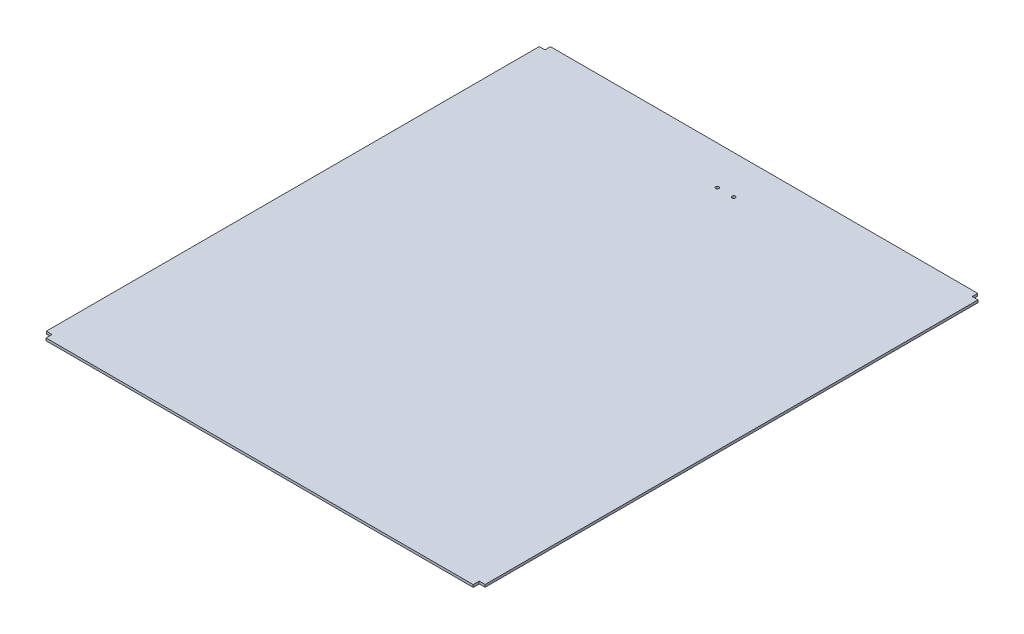
ISO-10303-21;
HEADER;
FILE_DESCRIPTION(('STEP AP214'),'2;1');
FILE_NAME('part.step','',(''),(''),'','','');
FILE_SCHEMA(('AUTOMOTIVE_DESIGN { 1 0 10303 214 1 1 1 1 }'));
ENDSEC;
DATA;
#1=APPLICATION_CONTEXT('core data for automotive mechanical design processes');
#2=APPLICATION_PROTOCOL_DEFINITION('international standard','automotive_design',2000,#1);
#3=PRODUCT_CONTEXT('',#1,'mechanical');
#4=PRODUCT('Part','Part','',(#3));
#5=PRODUCT_RELATED_PRODUCT_CATEGORY('part','',(#4));
#6=PRODUCT_DEFINITION_FORMATION('','',#4);
#7=PRODUCT_DEFINITION_CONTEXT('part definition',#1,'design');
#8=PRODUCT_DEFINITION('design','',#6,#7);
#9=PRODUCT_DEFINITION_SHAPE('','',#8);
#10=(LENGTH_UNIT() NAMED_UNIT(*) SI_UNIT(.MILLI.,.METRE.));
#11=(NAMED_UNIT(*) PLANE_ANGLE_UNIT() SI_UNIT($,.RADIAN.));
#12=(NAMED_UNIT(*) SI_UNIT($,.STERADIAN.) SOLID_ANGLE_UNIT());
#13=UNCERTAINTY_MEASURE_WITH_UNIT(LENGTH_MEASURE(1.E-05),#10,'distance_accuracy_value','');
#14=(GEOMETRIC_REPRESENTATION_CONTEXT(3) GLOBAL_UNCERTAINTY_ASSIGNED_CONTEXT((#13)) GLOBAL_UNIT_ASSIGNED_CONTEXT((#10,
#11,#12)) REPRESENTATION_CONTEXT('',''));
#15=CARTESIAN_POINT('',(0.,0.,0.));
#16=DIRECTION('',(0.,0.,1.));
#17=DIRECTION('',(1.,0.,0.));
#18=AXIS2_PLACEMENT_3D('',#15,#16,#17);
#19=CARTESIAN_POINT('',(0.0465208544824236,3.,-0.291126182503376));
#20=DIRECTION('',(0.,0.,-1.));
#21=DIRECTION('',(-1.,0.,0.));
#22=AXIS2_PLACEMENT_3D('',#19,#20,#21);
#23=PLANE('',#22);
#24=DIRECTION('',(0.,-1.,0.));
#25=VECTOR('',#24,1.);
#26=CARTESIAN_POINT('',(7.00000000000001,3.,-0.291126182503376));
#27=LINE('',#26,#25);
#28=CARTESIAN_POINT('',(6.99999999999996,3.,-0.291126182503376));
#29=VERTEX_POINT('',#28);
#30=CARTESIAN_POINT('',(6.99999999999996,0.,-0.291126182503376));
#31=VERTEX_POINT('',#30);
#32=EDGE_CURVE('E164',#29,#31,#27,.T.);
#33=ORIENTED_EDGE('',*,*,#32,.F.);
#34=DIRECTION('',(1.,0.,0.));
#35=VECTOR('',#34,1.);
#36=CARTESIAN_POINT('',(0.0465208544824236,3.,-0.291126182503376));
#37=LINE('',#36,#35);
#38=CARTESIAN_POINT('',(0.0465208544824236,3.,-0.291126182503376));
#39=VERTEX_POINT('',#38);
#40=EDGE_CURVE('E133',#39,#29,#37,.T.);
#41=ORIENTED_EDGE('',*,*,#40,.F.);
#42=DIRECTION('',(0.,-1.,0.));
#43=VECTOR('',#42,1.);
#44=CARTESIAN_POINT('',(0.0465208544824236,3.,-0.291126182503376));
#45=LINE('',#44,#43);
#46=CARTESIAN_POINT('',(0.0465208544824236,0.,-0.291126182503376));
#47=VERTEX_POINT('',#46);
#48=EDGE_CURVE('E11',#39,#47,#45,.T.);
#49=ORIENTED_EDGE('',*,*,#48,.T.);
#50=DIRECTION('',(1.,0.,0.));
#51=VECTOR('',#50,1.);
#52=CARTESIAN_POINT('',(0.0465208544824236,0.,-0.291126182503376));
#53=LINE('',#52,#51);
#54=EDGE_CURVE('E180',#47,#31,#53,.T.);
#55=ORIENTED_EDGE('',*,*,#54,.T.);
#56=EDGE_LOOP('',(#33,#41,#49,#55));
#57=FACE_BOUND('',#56,.T.);
#58=ADVANCED_FACE('F33',(#57),#23,.F.);
#59=DIRECTION('',(0.,1.,0.));
#60=VECTOR('',#59,1.);
#61=CARTESIAN_POINT('',(527.,3.,-0.291126182503376));
#62=LINE('',#61,#60);
#63=CARTESIAN_POINT('',(527.,0.,-0.291126182503376));
#64=VERTEX_POINT('',#63);
#65=CARTESIAN_POINT('',(527.,3.,-0.291126182503376));
#66=VERTEX_POINT('',#65);
#67=EDGE_CURVE('E154',#64,#66,#62,.T.);
#68=ORIENTED_EDGE('',*,*,#67,.F.);
#69=CARTESIAN_POINT('',(534.046520854482,0.,-0.291126182503376));
#70=VERTEX_POINT('',#69);
#71=EDGE_CURVE('E179',#64,#70,#53,.T.);
#72=ORIENTED_EDGE('',*,*,#71,.T.);
#73=DIRECTION('',(0.,-1.,0.));
#74=VECTOR('',#73,1.);
#75=CARTESIAN_POINT('',(534.046520854482,3.,-0.291126182503376));
#76=LINE('',#75,#74);
#77=CARTESIAN_POINT('',(534.046520854482,3.,-0.291126182503376));
#78=VERTEX_POINT('',#77);
#79=EDGE_CURVE('E42',#78,#70,#76,.T.);
#80=ORIENTED_EDGE('',*,*,#79,.F.);
#81=EDGE_CURVE('E169',#66,#78,#37,.T.);
#82=ORIENTED_EDGE('',*,*,#81,.F.);
#83=EDGE_LOOP('',(#68,#72,#80,#82));
#84=FACE_BOUND('',#83,.T.);
#85=ADVANCED_FACE('F255',(#84),#23,.F.);
#86=CARTESIAN_POINT('',(0.0465208544824236,3.,-600.291126182503));
#87=DIRECTION('',(0.,0.,1.));
#88=DIRECTION('',(1.,0.,0.));
#89=AXIS2_PLACEMENT_3D('',#86,#87,#88);
#90=PLANE('',#89);
#91=DIRECTION('',(0.,1.,0.));
#92=VECTOR('',#91,1.);
#93=CARTESIAN_POINT('',(6.99999999999992,3.,-600.291126182503));
#94=LINE('',#93,#92);
#95=CARTESIAN_POINT('',(6.99999999999992,0.,-600.291126182503));
#96=VERTEX_POINT('',#95);
#97=CARTESIAN_POINT('',(6.99999999999996,3.,-600.291126182503));
#98=VERTEX_POINT('',#97);
#99=EDGE_CURVE('E162',#96,#98,#94,.T.);
#100=ORIENTED_EDGE('',*,*,#99,.F.);
#101=DIRECTION('',(-1.,0.,0.));
#102=VECTOR('',#101,1.);
#103=CARTESIAN_POINT('',(0.0465208544824236,0.,-600.291126182503));
#104=LINE('',#103,#102);
#105=CARTESIAN_POINT('',(0.0465208544824236,0.,-600.291126182503));
#106=VERTEX_POINT('',#105);
#107=EDGE_CURVE('E184',#96,#106,#104,.T.);
#108=ORIENTED_EDGE('',*,*,#107,.T.);
#109=DIRECTION('',(0.,-1.,0.));
#110=VECTOR('',#109,1.);
#111=CARTESIAN_POINT('',(0.0465208544824236,3.,-600.291126182503));
#112=LINE('',#111,#110);
#113=CARTESIAN_POINT('',(0.0465208544824236,3.,-600.291126182503));
#114=VERTEX_POINT('',#113);
#115=EDGE_CURVE('E176',#114,#106,#112,.T.);
#116=ORIENTED_EDGE('',*,*,#115,.F.);
#117=DIRECTION('',(-1.,0.,0.));
#118=VECTOR('',#117,1.);
#119=CARTESIAN_POINT('',(0.0465208544824236,3.,-600.291126182503));
#120=LINE('',#119,#118);
#121=EDGE_CURVE('E50',#98,#114,#120,.T.);
#122=ORIENTED_EDGE('',*,*,#121,.F.);
#123=EDGE_LOOP('',(#100,#108,#116,#122));
#124=FACE_BOUND('',#123,.T.);
#125=ADVANCED_FACE('F260',(#124),#90,.F.);
#126=DIRECTION('',(0.,-1.,0.));
#127=VECTOR('',#126,1.);
#128=CARTESIAN_POINT('',(527.,3.,-600.291126182503));
#129=LINE('',#128,#127);
#130=CARTESIAN_POINT('',(527.,3.,-600.291126182503));
#131=VERTEX_POINT('',#130);
#132=CARTESIAN_POINT('',(527.,0.,-600.291126182503));
#133=VERTEX_POINT('',#132);
#134=EDGE_CURVE('E58',#131,#133,#129,.T.);
#135=ORIENTED_EDGE('',*,*,#134,.F.);
#136=CARTESIAN_POINT('',(534.046520854482,3.,-600.291126182503));
#137=VERTEX_POINT('',#136);
#138=EDGE_CURVE('E174',#137,#131,#120,.T.);
#139=ORIENTED_EDGE('',*,*,#138,.F.);
#140=DIRECTION('',(0.,-1.,0.));
#141=VECTOR('',#140,1.);
#142=CARTESIAN_POINT('',(534.046520854482,3.,-600.291126182503));
#143=LINE('',#142,#141);
#144=CARTESIAN_POINT('',(534.046520854482,0.,-600.291126182503));
#145=VERTEX_POINT('',#144);
#146=EDGE_CURVE('E188',#137,#145,#143,.T.);
#147=ORIENTED_EDGE('',*,*,#146,.T.);
#148=EDGE_CURVE('E170',#145,#133,#104,.T.);
#149=ORIENTED_EDGE('',*,*,#148,.T.);
#150=EDGE_LOOP('',(#135,#139,#147,#149));
#151=FACE_BOUND('',#150,.T.);
#152=ADVANCED_FACE('F269',(#151),#90,.F.);
#153=CARTESIAN_POINT('',(0.0465208544824236,3.,-0.291126182503376));
#154=DIRECTION('',(1.,0.,0.));
#155=DIRECTION('',(0.,0.,-1.));
#156=AXIS2_PLACEMENT_3D('',#153,#154,#155);
#157=PLANE('',#156);
#158=DIRECTION('',(0.,0.,1.));
#159=VECTOR('',#158,1.);
#160=CARTESIAN_POINT('',(0.0465208544824236,0.,-0.291126182503376));
#161=LINE('',#160,#159);
#162=EDGE_CURVE('E166',#106,#47,#161,.T.);
#163=ORIENTED_EDGE('',*,*,#162,.T.);
#164=ORIENTED_EDGE('',*,*,#48,.F.);
#165=DIRECTION('',(0.,0.,1.));
#166=VECTOR('',#165,1.);
#167=CARTESIAN_POINT('',(0.0465208544824236,3.,-0.291126182503376));
#168=LINE('',#167,#166);
#169=EDGE_CURVE('E167',#114,#39,#168,.T.);
#170=ORIENTED_EDGE('',*,*,#169,.F.);
#171=ORIENTED_EDGE('',*,*,#115,.T.);
#172=EDGE_LOOP('',(#163,#164,#170,#171));
#173=FACE_BOUND('',#172,.T.);
#174=ADVANCED_FACE('F35',(#173),#157,.F.);
#175=CARTESIAN_POINT('',(534.046520854482,3.,-0.291126182503376));
#176=DIRECTION('',(-1.,0.,0.));
#177=DIRECTION('',(0.,0.,1.));
#178=AXIS2_PLACEMENT_3D('',#175,#176,#177);
#179=PLANE('',#178);
#180=DIRECTION('',(0.,0.,-1.));
#181=VECTOR('',#180,1.);
#182=CARTESIAN_POINT('',(534.046520854482,0.,-0.291126182503376));
#183=LINE('',#182,#181);
#184=EDGE_CURVE('E182',#70,#145,#183,.T.);
#185=ORIENTED_EDGE('',*,*,#184,.T.);
#186=ORIENTED_EDGE('',*,*,#146,.F.);
#187=DIRECTION('',(0.,0.,-1.));
#188=VECTOR('',#187,1.);
#189=CARTESIAN_POINT('',(534.046520854482,3.,-0.291126182503376));
#190=LINE('',#189,#188);
#191=EDGE_CURVE('E172',#78,#137,#190,.T.);
#192=ORIENTED_EDGE('',*,*,#191,.F.);
#193=ORIENTED_EDGE('',*,*,#79,.T.);
#194=EDGE_LOOP('',(#185,#186,#192,#193));
#195=FACE_BOUND('',#194,.T.);
#196=ADVANCED_FACE('F263',(#195),#179,.F.);
#197=CARTESIAN_POINT('',(0.,3.,0.));
#198=DIRECTION('',(0.,-1.,0.));
#199=DIRECTION('',(0.,0.,-1.));
#200=AXIS2_PLACEMENT_3D('',#197,#198,#199);
#201=PLANE('',#200);
#202=CARTESIAN_POINT('',(257.025,3.,-560.));
#203=DIRECTION('',(0.,1.,0.));
#204=DIRECTION('',(0.,0.,1.));
#205=AXIS2_PLACEMENT_3D('',#202,#203,#204);
#206=CIRCLE('',#205,2.);
#207=CARTESIAN_POINT('',(257.025,3.,-558.));
#208=VERTEX_POINT('',#207);
#209=EDGE_CURVE('E194',#208,#208,#206,.T.);
#210=ORIENTED_EDGE('',*,*,#209,.F.);
#211=EDGE_LOOP('',(#210));
#212=FACE_BOUND('',#211,.T.);
#213=CARTESIAN_POINT('',(277.025,3.,-560.));
#214=DIRECTION('',(0.,1.,0.));
#215=DIRECTION('',(0.,0.,1.));
#216=AXIS2_PLACEMENT_3D('',#213,#214,#215);
#217=CIRCLE('',#216,2.);
#218=CARTESIAN_POINT('',(277.025,3.,-558.));
#219=VERTEX_POINT('',#218);
#220=EDGE_CURVE('E199',#219,#219,#217,.T.);
#221=ORIENTED_EDGE('',*,*,#220,.F.);
#222=EDGE_LOOP('',(#221));
#223=FACE_BOUND('',#222,.T.);
#224=ORIENTED_EDGE('',*,*,#138,.T.);
#225=DIRECTION('',(0.,0.,-1.));
#226=VECTOR('',#225,1.);
#227=CARTESIAN_POINT('',(527.,3.,-607.));
#228=LINE('',#227,#226);
#229=CARTESIAN_POINT('',(527.,3.,-607.));
#230=VERTEX_POINT('',#229);
#231=EDGE_CURVE('E147',#131,#230,#228,.T.);
#232=ORIENTED_EDGE('',*,*,#231,.T.);
#233=DIRECTION('',(-1.,0.,0.));
#234=VECTOR('',#233,1.);
#235=CARTESIAN_POINT('',(6.99999999999992,3.,-607.));
#236=LINE('',#235,#234);
#237=CARTESIAN_POINT('',(6.99999999999992,3.,-607.));
#238=VERTEX_POINT('',#237);
#239=EDGE_CURVE('E209',#230,#238,#236,.T.);
#240=ORIENTED_EDGE('',*,*,#239,.T.);
#241=DIRECTION('',(0.,0.,1.));
#242=VECTOR('',#241,1.);
#243=CARTESIAN_POINT('',(6.99999999999992,3.,-607.));
#244=LINE('',#243,#242);
#245=EDGE_CURVE('E137',#238,#98,#244,.T.);
#246=ORIENTED_EDGE('',*,*,#245,.T.);
#247=ORIENTED_EDGE('',*,*,#121,.T.);
#248=ORIENTED_EDGE('',*,*,#169,.T.);
#249=ORIENTED_EDGE('',*,*,#40,.T.);
#250=CARTESIAN_POINT('',(7.00000000000001,3.,7.));
#251=VERTEX_POINT('',#250);
#252=EDGE_CURVE('E126',#29,#251,#244,.T.);
#253=ORIENTED_EDGE('',*,*,#252,.T.);
#254=DIRECTION('',(1.,0.,0.));
#255=VECTOR('',#254,1.);
#256=CARTESIAN_POINT('',(7.00000000000001,3.,7.));
#257=LINE('',#256,#255);
#258=CARTESIAN_POINT('',(527.,3.,7.));
#259=VERTEX_POINT('',#258);
#260=EDGE_CURVE('E130',#251,#259,#257,.T.);
#261=ORIENTED_EDGE('',*,*,#260,.T.);
#262=EDGE_CURVE('E207',#259,#66,#228,.T.);
#263=ORIENTED_EDGE('',*,*,#262,.T.);
#264=ORIENTED_EDGE('',*,*,#81,.T.);
#265=ORIENTED_EDGE('',*,*,#191,.T.);
#266=EDGE_LOOP('',(#224,#232,#240,#246,#247,#248,#249,#253,#261,#263,#264,#265));
#267=FACE_BOUND('',#266,.T.);
#268=ADVANCED_FACE('F128',(#212,#223,#267),#201,.F.);
#269=CARTESIAN_POINT('',(0.,0.,0.));
#270=DIRECTION('',(0.,-1.,0.));
#271=DIRECTION('',(0.,0.,-1.));
#272=AXIS2_PLACEMENT_3D('',#269,#270,#271);
#273=PLANE('',#272);
#274=CARTESIAN_POINT('',(257.025,0.,-560.));
#275=DIRECTION('',(0.,-1.,0.));
#276=DIRECTION('',(0.,0.,-1.));
#277=AXIS2_PLACEMENT_3D('',#274,#275,#276);
#278=CIRCLE('',#277,2.);
#279=CARTESIAN_POINT('',(257.025,0.,-562.));
#280=VERTEX_POINT('',#279);
#281=EDGE_CURVE('E37',#280,#280,#278,.T.);
#282=ORIENTED_EDGE('',*,*,#281,.F.);
#283=EDGE_LOOP('',(#282));
#284=FACE_BOUND('',#283,.T.);
#285=CARTESIAN_POINT('',(277.025,0.,-560.));
#286=DIRECTION('',(0.,-1.,0.));
#287=DIRECTION('',(0.,0.,-1.));
#288=AXIS2_PLACEMENT_3D('',#285,#286,#287);
#289=CIRCLE('',#288,2.);
#290=CARTESIAN_POINT('',(277.025,0.,-562.));
#291=VERTEX_POINT('',#290);
#292=EDGE_CURVE('E192',#291,#291,#289,.T.);
#293=ORIENTED_EDGE('',*,*,#292,.F.);
#294=EDGE_LOOP('',(#293));
#295=FACE_BOUND('',#294,.T.);
#296=ORIENTED_EDGE('',*,*,#71,.F.);
#297=DIRECTION('',(0.,0.,-1.));
#298=VECTOR('',#297,1.);
#299=CARTESIAN_POINT('',(527.,0.,-607.));
#300=LINE('',#299,#298);
#301=CARTESIAN_POINT('',(527.,0.,7.));
#302=VERTEX_POINT('',#301);
#303=EDGE_CURVE('E218',#302,#64,#300,.T.);
#304=ORIENTED_EDGE('',*,*,#303,.F.);
#305=DIRECTION('',(1.,0.,0.));
#306=VECTOR('',#305,1.);
#307=CARTESIAN_POINT('',(7.00000000000001,0.,7.));
#308=LINE('',#307,#306);
#309=CARTESIAN_POINT('',(7.00000000000001,0.,7.));
#310=VERTEX_POINT('',#309);
#311=EDGE_CURVE('E215',#310,#302,#308,.T.);
#312=ORIENTED_EDGE('',*,*,#311,.F.);
#313=DIRECTION('',(0.,0.,1.));
#314=VECTOR('',#313,1.);
#315=CARTESIAN_POINT('',(6.99999999999992,0.,-607.));
#316=LINE('',#315,#314);
#317=EDGE_CURVE('E151',#31,#310,#316,.T.);
#318=ORIENTED_EDGE('',*,*,#317,.F.);
#319=ORIENTED_EDGE('',*,*,#54,.F.);
#320=ORIENTED_EDGE('',*,*,#162,.F.);
#321=ORIENTED_EDGE('',*,*,#107,.F.);
#322=CARTESIAN_POINT('',(6.99999999999992,0.,-607.));
#323=VERTEX_POINT('',#322);
#324=EDGE_CURVE('E212',#323,#96,#316,.T.);
#325=ORIENTED_EDGE('',*,*,#324,.F.);
#326=DIRECTION('',(-1.,0.,0.));
#327=VECTOR('',#326,1.);
#328=CARTESIAN_POINT('',(6.99999999999992,0.,-607.));
#329=LINE('',#328,#327);
#330=CARTESIAN_POINT('',(527.,0.,-607.));
#331=VERTEX_POINT('',#330);
#332=EDGE_CURVE('E138',#331,#323,#329,.T.);
#333=ORIENTED_EDGE('',*,*,#332,.F.);
#334=EDGE_CURVE('E217',#133,#331,#300,.T.);
#335=ORIENTED_EDGE('',*,*,#334,.F.);
#336=ORIENTED_EDGE('',*,*,#148,.F.);
#337=ORIENTED_EDGE('',*,*,#184,.F.);
#338=EDGE_LOOP('',(#296,#304,#312,#318,#319,#320,#321,#325,#333,#335,#336,#337));
#339=FACE_BOUND('',#338,.T.);
#340=ADVANCED_FACE('F235',(#284,#295,#339),#273,.T.);
#341=CARTESIAN_POINT('',(6.99999999999992,3.,-607.));
#342=DIRECTION('',(0.,0.,1.));
#343=DIRECTION('',(1.,0.,0.));
#344=AXIS2_PLACEMENT_3D('',#341,#342,#343);
#345=PLANE('',#344);
#346=ORIENTED_EDGE('',*,*,#332,.T.);
#347=DIRECTION('',(0.,-1.,0.));
#348=VECTOR('',#347,1.);
#349=CARTESIAN_POINT('',(6.99999999999992,3.,-607.));
#350=LINE('',#349,#348);
#351=EDGE_CURVE('E211',#238,#323,#350,.T.);
#352=ORIENTED_EDGE('',*,*,#351,.F.);
#353=ORIENTED_EDGE('',*,*,#239,.F.);
#354=DIRECTION('',(0.,-1.,0.));
#355=VECTOR('',#354,1.);
#356=CARTESIAN_POINT('',(527.,3.,-607.));
#357=LINE('',#356,#355);
#358=EDGE_CURVE('E156',#230,#331,#357,.T.);
#359=ORIENTED_EDGE('',*,*,#358,.T.);
#360=EDGE_LOOP('',(#346,#352,#353,#359));
#361=FACE_BOUND('',#360,.T.);
#362=ADVANCED_FACE('F228',(#361),#345,.F.);
#363=CARTESIAN_POINT('',(527.,3.,-607.));
#364=DIRECTION('',(-1.,0.,0.));
#365=DIRECTION('',(0.,0.,1.));
#366=AXIS2_PLACEMENT_3D('',#363,#364,#365);
#367=PLANE('',#366);
#368=ORIENTED_EDGE('',*,*,#231,.F.);
#369=ORIENTED_EDGE('',*,*,#134,.T.);
#370=ORIENTED_EDGE('',*,*,#334,.T.);
#371=ORIENTED_EDGE('',*,*,#358,.F.);
#372=EDGE_LOOP('',(#368,#369,#370,#371));
#373=FACE_BOUND('',#372,.T.);
#374=ADVANCED_FACE('F241',(#373),#367,.F.);
#375=CARTESIAN_POINT('',(6.99999999999992,3.,-607.));
#376=DIRECTION('',(1.,0.,0.));
#377=DIRECTION('',(0.,0.,-1.));
#378=AXIS2_PLACEMENT_3D('',#375,#376,#377);
#379=PLANE('',#378);
#380=ORIENTED_EDGE('',*,*,#324,.T.);
#381=ORIENTED_EDGE('',*,*,#99,.T.);
#382=ORIENTED_EDGE('',*,*,#245,.F.);
#383=ORIENTED_EDGE('',*,*,#351,.T.);
#384=EDGE_LOOP('',(#380,#381,#382,#383));
#385=FACE_BOUND('',#384,.T.);
#386=ADVANCED_FACE('F239',(#385),#379,.F.);
#387=ORIENTED_EDGE('',*,*,#252,.F.);
#388=ORIENTED_EDGE('',*,*,#32,.T.);
#389=ORIENTED_EDGE('',*,*,#317,.T.);
#390=DIRECTION('',(0.,-1.,0.));
#391=VECTOR('',#390,1.);
#392=CARTESIAN_POINT('',(7.00000000000001,3.,7.));
#393=LINE('',#392,#391);
#394=EDGE_CURVE('E143',#251,#310,#393,.T.);
#395=ORIENTED_EDGE('',*,*,#394,.F.);
#396=EDGE_LOOP('',(#387,#388,#389,#395));
#397=FACE_BOUND('',#396,.T.);
#398=ADVANCED_FACE('F149',(#397),#379,.F.);
#399=ORIENTED_EDGE('',*,*,#303,.T.);
#400=ORIENTED_EDGE('',*,*,#67,.T.);
#401=ORIENTED_EDGE('',*,*,#262,.F.);
#402=DIRECTION('',(0.,-1.,0.));
#403=VECTOR('',#402,1.);
#404=CARTESIAN_POINT('',(527.,3.,7.));
#405=LINE('',#404,#403);
#406=EDGE_CURVE('E145',#259,#302,#405,.T.);
#407=ORIENTED_EDGE('',*,*,#406,.T.);
#408=EDGE_LOOP('',(#399,#400,#401,#407));
#409=FACE_BOUND('',#408,.T.);
#410=ADVANCED_FACE('F244',(#409),#367,.F.);
#411=CARTESIAN_POINT('',(7.00000000000001,3.,7.));
#412=DIRECTION('',(0.,0.,-1.));
#413=DIRECTION('',(-1.,0.,0.));
#414=AXIS2_PLACEMENT_3D('',#411,#412,#413);
#415=PLANE('',#414);
#416=ORIENTED_EDGE('',*,*,#311,.T.);
#417=ORIENTED_EDGE('',*,*,#406,.F.);
#418=ORIENTED_EDGE('',*,*,#260,.F.);
#419=ORIENTED_EDGE('',*,*,#394,.T.);
#420=EDGE_LOOP('',(#416,#417,#418,#419));
#421=FACE_BOUND('',#420,.T.);
#422=ADVANCED_FACE('F142',(#421),#415,.F.);
#423=CARTESIAN_POINT('',(277.025,-7.,-560.));
#424=DIRECTION('',(0.,1.,0.));
#425=DIRECTION('',(0.,0.,1.));
#426=AXIS2_PLACEMENT_3D('',#423,#424,#425);
#427=CYLINDRICAL_SURFACE('',#426,2.);
#428=ORIENTED_EDGE('',*,*,#292,.T.);
#429=EDGE_LOOP('',(#428));
#430=FACE_BOUND('',#429,.T.);
#431=ORIENTED_EDGE('',*,*,#220,.T.);
#432=EDGE_LOOP('',(#431));
#433=FACE_BOUND('',#432,.T.);
#434=ADVANCED_FACE('F277',(#430,#433),#427,.F.);
#435=CARTESIAN_POINT('',(257.025,-7.,-560.));
#436=DIRECTION('',(0.,1.,0.));
#437=DIRECTION('',(0.,0.,1.));
#438=AXIS2_PLACEMENT_3D('',#435,#436,#437);
#439=CYLINDRICAL_SURFACE('',#438,2.);
#440=ORIENTED_EDGE('',*,*,#281,.T.);
#441=EDGE_LOOP('',(#440));
#442=FACE_BOUND('',#441,.T.);
#443=ORIENTED_EDGE('',*,*,#209,.T.);
#444=EDGE_LOOP('',(#443));
#445=FACE_BOUND('',#444,.T.);
#446=ADVANCED_FACE('F281',(#442,#445),#439,.F.);
#447=CLOSED_SHELL('',(#58,#85,#125,#152,#174,#196,#268,#340,#362,#374,#386,#398,#410,#422,#434,#446));
#448=MANIFOLD_SOLID_BREP('B2',#447);
#449=ADVANCED_BREP_SHAPE_REPRESENTATION('',(#18,#448),#14);
#450=SHAPE_DEFINITION_REPRESENTATION(#9,#449);
ENDSEC;
END-ISO-10303-21;
